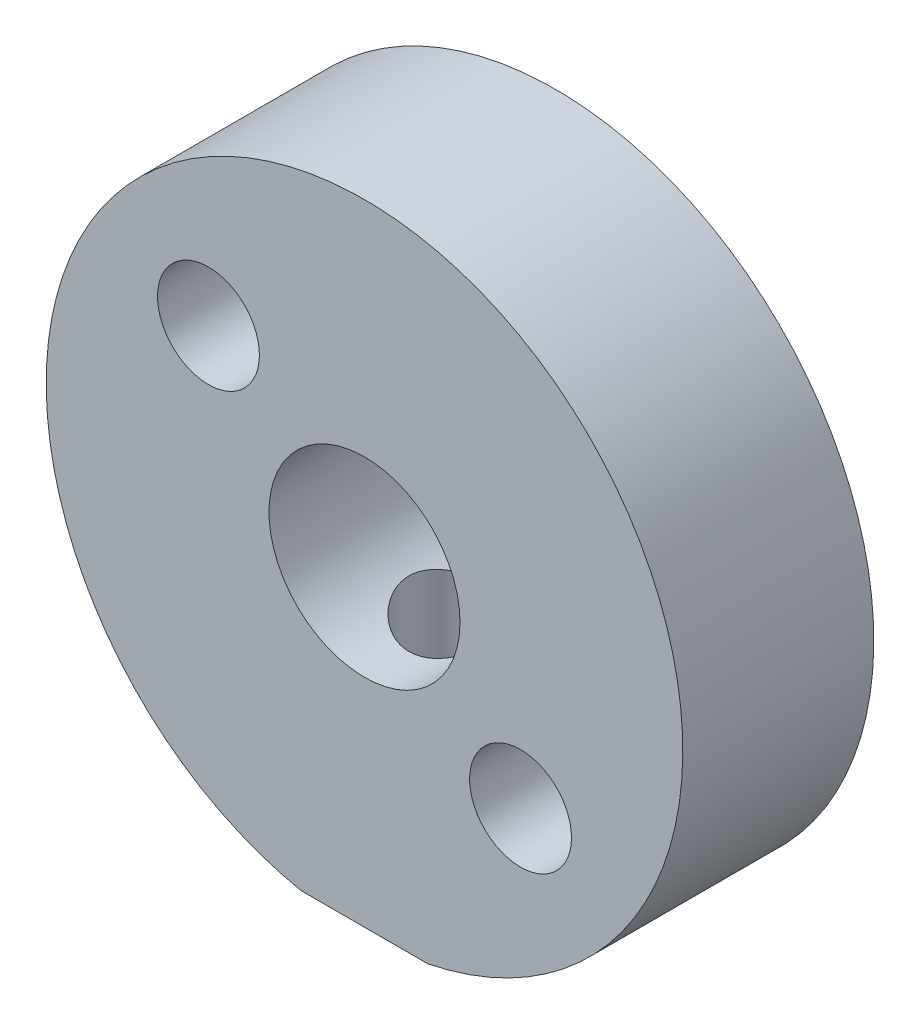
ISO-10303-21;
HEADER;
FILE_DESCRIPTION(('STEP AP214'),'2;1');
FILE_NAME('part.step','',(''),(''),'','','');
FILE_SCHEMA(('AUTOMOTIVE_DESIGN { 1 0 10303 214 1 1 1 1 }'));
ENDSEC;
DATA;
#1=APPLICATION_CONTEXT('core data for automotive mechanical design processes');
#2=APPLICATION_PROTOCOL_DEFINITION('international standard','automotive_design',2000,#1);
#3=PRODUCT_CONTEXT('',#1,'mechanical');
#4=PRODUCT('Part','Part','',(#3));
#5=PRODUCT_RELATED_PRODUCT_CATEGORY('part','',(#4));
#6=PRODUCT_DEFINITION_FORMATION('','',#4);
#7=PRODUCT_DEFINITION_CONTEXT('part definition',#1,'design');
#8=PRODUCT_DEFINITION('design','',#6,#7);
#9=PRODUCT_DEFINITION_SHAPE('','',#8);
#10=(LENGTH_UNIT() NAMED_UNIT(*) SI_UNIT(.MILLI.,.METRE.));
#11=(NAMED_UNIT(*) PLANE_ANGLE_UNIT() SI_UNIT($,.RADIAN.));
#12=(NAMED_UNIT(*) SI_UNIT($,.STERADIAN.) SOLID_ANGLE_UNIT());
#13=UNCERTAINTY_MEASURE_WITH_UNIT(LENGTH_MEASURE(1.E-05),#10,'distance_accuracy_value','');
#14=(GEOMETRIC_REPRESENTATION_CONTEXT(3) GLOBAL_UNCERTAINTY_ASSIGNED_CONTEXT((#13)) GLOBAL_UNIT_ASSIGNED_CONTEXT((#10,
#11,#12)) REPRESENTATION_CONTEXT('',''));
#15=CARTESIAN_POINT('',(0.,0.,0.));
#16=DIRECTION('',(0.,0.,1.));
#17=DIRECTION('',(1.,0.,0.));
#18=AXIS2_PLACEMENT_3D('',#15,#16,#17);
#19=CARTESIAN_POINT('',(0.,0.,1.5));
#20=DIRECTION('',(0.,0.,1.));
#21=DIRECTION('',(1.,0.,0.));
#22=AXIS2_PLACEMENT_3D('',#19,#20,#21);
#23=PLANE('',#22);
#24=DIRECTION('',(-1.,0.,0.));
#25=VECTOR('',#24,1.);
#26=CARTESIAN_POINT('',(0.,-4.9,1.5));
#27=LINE('',#26,#25);
#28=CARTESIAN_POINT('',(0.994987437106618,-4.9,1.5));
#29=VERTEX_POINT('',#28);
#30=CARTESIAN_POINT('',(-0.994987437106618,-4.9,1.5));
#31=VERTEX_POINT('',#30);
#32=EDGE_CURVE('E53',#29,#31,#27,.T.);
#33=ORIENTED_EDGE('',*,*,#32,.F.);
#34=CARTESIAN_POINT('',(0.,0.,1.5));
#35=DIRECTION('',(0.,0.,1.));
#36=DIRECTION('',(1.,0.,0.));
#37=AXIS2_PLACEMENT_3D('',#34,#35,#36);
#38=CIRCLE('',#37,5.);
#39=EDGE_CURVE('E11',#29,#31,#38,.T.);
#40=ORIENTED_EDGE('',*,*,#39,.T.);
#41=EDGE_LOOP('',(#33,#40));
#42=FACE_BOUND('',#41,.T.);
#43=CARTESIAN_POINT('',(-2.45134221797273,2.05692035100051,1.5));
#44=DIRECTION('',(0.,0.,1.));
#45=DIRECTION('',(1.,0.,0.));
#46=AXIS2_PLACEMENT_3D('',#43,#44,#45);
#47=CIRCLE('',#46,0.799999999999498);
#48=CARTESIAN_POINT('',(-1.65134221797323,2.05692035100051,1.5));
#49=VERTEX_POINT('',#48);
#50=EDGE_CURVE('E79',#49,#49,#47,.T.);
#51=ORIENTED_EDGE('',*,*,#50,.F.);
#52=EDGE_LOOP('',(#51));
#53=FACE_BOUND('',#52,.T.);
#54=CARTESIAN_POINT('',(2.45134221797309,-2.05692035100051,1.5));
#55=DIRECTION('',(0.,0.,1.));
#56=DIRECTION('',(1.,0.,0.));
#57=AXIS2_PLACEMENT_3D('',#54,#55,#56);
#58=CIRCLE('',#57,0.800000000000502);
#59=CARTESIAN_POINT('',(3.25134221797359,-2.05692035100051,1.5));
#60=VERTEX_POINT('',#59);
#61=EDGE_CURVE('E87',#60,#60,#58,.T.);
#62=ORIENTED_EDGE('',*,*,#61,.F.);
#63=EDGE_LOOP('',(#62));
#64=FACE_BOUND('',#63,.T.);
#65=CARTESIAN_POINT('',(0.,0.,1.5));
#66=DIRECTION('',(0.,0.,1.));
#67=DIRECTION('',(1.,0.,0.));
#68=AXIS2_PLACEMENT_3D('',#65,#66,#67);
#69=CIRCLE('',#68,1.5);
#70=CARTESIAN_POINT('',(1.5,0.,1.5));
#71=VERTEX_POINT('',#70);
#72=EDGE_CURVE('E92',#71,#71,#69,.T.);
#73=ORIENTED_EDGE('',*,*,#72,.F.);
#74=EDGE_LOOP('',(#73));
#75=FACE_BOUND('',#74,.T.);
#76=ADVANCED_FACE('F36',(#42,#53,#64,#75),#23,.T.);
#77=CARTESIAN_POINT('',(0.,0.,-1.5));
#78=DIRECTION('',(0.,0.,1.));
#79=DIRECTION('',(1.,0.,0.));
#80=AXIS2_PLACEMENT_3D('',#77,#78,#79);
#81=PLANE('',#80);
#82=CARTESIAN_POINT('',(-2.45134221797273,2.05692035100051,-1.5));
#83=DIRECTION('',(0.,0.,1.));
#84=DIRECTION('',(1.,0.,0.));
#85=AXIS2_PLACEMENT_3D('',#82,#83,#84);
#86=CIRCLE('',#85,0.799999999999498);
#87=CARTESIAN_POINT('',(-1.65134221797323,2.05692035100051,-1.5));
#88=VERTEX_POINT('',#87);
#89=EDGE_CURVE('E82',#88,#88,#86,.T.);
#90=ORIENTED_EDGE('',*,*,#89,.T.);
#91=EDGE_LOOP('',(#90));
#92=FACE_BOUND('',#91,.T.);
#93=CARTESIAN_POINT('',(2.45134221797309,-2.05692035100051,-1.5));
#94=DIRECTION('',(0.,0.,1.));
#95=DIRECTION('',(1.,0.,0.));
#96=AXIS2_PLACEMENT_3D('',#93,#94,#95);
#97=CIRCLE('',#96,0.800000000000502);
#98=CARTESIAN_POINT('',(3.25134221797359,-2.05692035100051,-1.5));
#99=VERTEX_POINT('',#98);
#100=EDGE_CURVE('E83',#99,#99,#97,.T.);
#101=ORIENTED_EDGE('',*,*,#100,.T.);
#102=EDGE_LOOP('',(#101));
#103=FACE_BOUND('',#102,.T.);
#104=CARTESIAN_POINT('',(0.,0.,-1.5));
#105=DIRECTION('',(0.,0.,1.));
#106=DIRECTION('',(1.,0.,0.));
#107=AXIS2_PLACEMENT_3D('',#104,#105,#106);
#108=CIRCLE('',#107,5.);
#109=CARTESIAN_POINT('',(0.994987437106618,-4.9,-1.5));
#110=VERTEX_POINT('',#109);
#111=CARTESIAN_POINT('',(-0.994987437106618,-4.9,-1.5));
#112=VERTEX_POINT('',#111);
#113=EDGE_CURVE('E45',#110,#112,#108,.T.);
#114=ORIENTED_EDGE('',*,*,#113,.F.);
#115=DIRECTION('',(-1.,0.,0.));
#116=VECTOR('',#115,1.);
#117=CARTESIAN_POINT('',(0.,-4.9,-1.5));
#118=LINE('',#117,#116);
#119=EDGE_CURVE('E65',#110,#112,#118,.T.);
#120=ORIENTED_EDGE('',*,*,#119,.T.);
#121=EDGE_LOOP('',(#114,#120));
#122=FACE_BOUND('',#121,.T.);
#123=CARTESIAN_POINT('',(0.,0.,-1.5));
#124=DIRECTION('',(0.,0.,1.));
#125=DIRECTION('',(1.,0.,0.));
#126=AXIS2_PLACEMENT_3D('',#123,#124,#125);
#127=CIRCLE('',#126,1.5);
#128=CARTESIAN_POINT('',(1.5,0.,-1.5));
#129=VERTEX_POINT('',#128);
#130=EDGE_CURVE('E86',#129,#129,#127,.T.);
#131=ORIENTED_EDGE('',*,*,#130,.T.);
#132=EDGE_LOOP('',(#131));
#133=FACE_BOUND('',#132,.T.);
#134=ADVANCED_FACE('F125',(#92,#103,#122,#133),#81,.F.);
#135=CARTESIAN_POINT('',(0.,0.,1.5));
#136=DIRECTION('',(0.,0.,-1.));
#137=DIRECTION('',(-1.,0.,0.));
#138=AXIS2_PLACEMENT_3D('',#135,#136,#137);
#139=CYLINDRICAL_SURFACE('',#138,5.);
#140=ORIENTED_EDGE('',*,*,#39,.F.);
#141=DIRECTION('',(0.,0.,-1.));
#142=VECTOR('',#141,1.);
#143=CARTESIAN_POINT('',(0.994987437106618,-4.9,1.5));
#144=LINE('',#143,#142);
#145=EDGE_CURVE('E63',#29,#110,#144,.T.);
#146=ORIENTED_EDGE('',*,*,#145,.T.);
#147=ORIENTED_EDGE('',*,*,#113,.T.);
#148=DIRECTION('',(0.,0.,-1.));
#149=VECTOR('',#148,1.);
#150=CARTESIAN_POINT('',(-0.994987437106618,-4.9,1.5));
#151=LINE('',#150,#149);
#152=EDGE_CURVE('E57',#112,#31,#151,.F.);
#153=ORIENTED_EDGE('',*,*,#152,.T.);
#154=EDGE_LOOP('',(#140,#146,#147,#153));
#155=FACE_BOUND('',#154,.T.);
#156=ADVANCED_FACE('F38',(#155),#139,.T.);
#157=CARTESIAN_POINT('',(0.,0.,1.5));
#158=DIRECTION('',(0.,0.,-1.));
#159=DIRECTION('',(-1.,0.,0.));
#160=AXIS2_PLACEMENT_3D('',#157,#158,#159);
#161=CYLINDRICAL_SURFACE('',#160,1.5);
#162=CARTESIAN_POINT('',(0.,-1.5,0.8));
#163=CARTESIAN_POINT('',(0.041714004293709,-1.49999758414449,0.79999729171022));
#164=CARTESIAN_POINT('',(0.0834672912539168,-1.49824189360224,0.796718403587561));
#165=CARTESIAN_POINT('',(0.165718197334509,-1.49139129667971,0.783758299133951));
#166=CARTESIAN_POINT('',(0.206213769841148,-1.48629121869364,0.774067166996487));
#167=CARTESIAN_POINT('',(0.284638594945811,-1.47328036800654,0.748780160141689));
#168=CARTESIAN_POINT('',(0.322577512237572,-1.46538097991501,0.733208185810114));
#169=CARTESIAN_POINT('',(0.395235474229212,-1.4474774987237,0.696737448288011));
#170=CARTESIAN_POINT('',(0.429954504316264,-1.43747339607276,0.675838660924399));
#171=CARTESIAN_POINT('',(0.497767319459639,-1.41547900666031,0.627748438268247));
#172=CARTESIAN_POINT('',(0.530602027463185,-1.4034011481073,0.60023239648025));
#173=CARTESIAN_POINT('',(0.591434030661653,-1.37887042167267,0.540396854313251));
#174=CARTESIAN_POINT('',(0.619427089896366,-1.36641723648963,0.508073193266347));
#175=CARTESIAN_POINT('',(0.672354419511099,-1.34122140682262,0.436021941522241));
#176=CARTESIAN_POINT('',(0.696776837026744,-1.32855595701366,0.395887951336953));
#177=CARTESIAN_POINT('',(0.738426416316996,-1.30586838669548,0.311354318648837));
#178=CARTESIAN_POINT('',(0.755659138193531,-1.29584422578236,0.266958005193252));
#179=CARTESIAN_POINT('',(0.781243551670882,-1.28057394848523,0.177945730638708));
#180=CARTESIAN_POINT('',(0.790083117424791,-1.27506829565278,0.13351702790959));
#181=CARTESIAN_POINT('',(0.800094972405448,-1.26881331156942,0.0434961280342448));
#182=CARTESIAN_POINT('',(0.801276946959554,-1.26805797215382,-0.00209452613423204));
#183=CARTESIAN_POINT('',(0.796296021649253,-1.27118648805135,-0.0862218656466407));
#184=CARTESIAN_POINT('',(0.791143222976706,-1.2744325135639,-0.124848446622228));
#185=CARTESIAN_POINT('',(0.775413455073683,-1.28406317281932,-0.200574623942005));
#186=CARTESIAN_POINT('',(0.764834303757537,-1.29044906914779,-0.237673599505729));
#187=CARTESIAN_POINT('',(0.738390252390663,-1.30576277857079,-0.310338026573563));
#188=CARTESIAN_POINT('',(0.722411944930874,-1.31474447400447,-0.345850303085015));
#189=CARTESIAN_POINT('',(0.685716522966988,-1.3342504708289,-0.413869526357397));
#190=CARTESIAN_POINT('',(0.664997308543691,-1.34477545505385,-0.446375132369022));
#191=CARTESIAN_POINT('',(0.615868522436844,-1.36804524940245,-0.512485861213274));
#192=CARTESIAN_POINT('',(0.586776291159892,-1.38088899493241,-0.545550735246708));
#193=CARTESIAN_POINT('',(0.523451373374352,-1.40611558623123,-0.606575357689949));
#194=CARTESIAN_POINT('',(0.489215573049462,-1.41849814710228,-0.634531990793125));
#195=CARTESIAN_POINT('',(0.41402207703118,-1.44230010999534,-0.686137714914207));
#196=CARTESIAN_POINT('',(0.372785484410791,-1.45361823088172,-0.70943110819391));
#197=CARTESIAN_POINT('',(0.286226859736144,-1.47310395304255,-0.748547883176902));
#198=CARTESIAN_POINT('',(0.240908517249558,-1.48127436501701,-0.764377932003115));
#199=CARTESIAN_POINT('',(0.151832213955905,-1.4929099561423,-0.78667761240728));
#200=CARTESIAN_POINT('',(0.108300131382031,-1.49673204992477,-0.793860701309987));
#201=CARTESIAN_POINT('',(0.0204895975412033,-1.50050221027202,-0.800947503200433));
#202=CARTESIAN_POINT('',(-0.0237884072844008,-1.50045251716091,-0.80085542580229));
#203=CARTESIAN_POINT('',(-0.107545959760608,-1.49667382258832,-0.793750071169325));
#204=CARTESIAN_POINT('',(-0.147096449267732,-1.49327897244287,-0.787365359251738));
#205=CARTESIAN_POINT('',(-0.224469554831582,-1.48362188327846,-0.768892557902082));
#206=CARTESIAN_POINT('',(-0.262291990687247,-1.47735934596487,-0.756803875143303));
#207=CARTESIAN_POINT('',(-0.336250167522202,-1.46232570811689,-0.727025057531773));
#208=CARTESIAN_POINT('',(-0.372320333376869,-1.4534959496239,-0.709202765081717));
#209=CARTESIAN_POINT('',(-0.441062157410962,-1.43413438081761,-0.668624845698398));
#210=CARTESIAN_POINT('',(-0.473732482002725,-1.42360190671964,-0.645867293623103));
#211=CARTESIAN_POINT('',(-0.538489644606411,-1.40047645695353,-0.59325519889227));
#212=CARTESIAN_POINT('',(-0.570134865108252,-1.38778372966929,-0.56290033267114));
#213=CARTESIAN_POINT('',(-0.628109862741503,-1.36252708549313,-0.497387164084843));
#214=CARTESIAN_POINT('',(-0.654434715474712,-1.34996329805962,-0.462224461707956));
#215=CARTESIAN_POINT('',(-0.70274076630891,-1.32549514327965,-0.385173513824971));
#216=CARTESIAN_POINT('',(-0.724310244689175,-1.31369210729127,-0.342991861220585));
#217=CARTESIAN_POINT('',(-0.759824848176573,-1.29347935062968,-0.25478990991383));
#218=CARTESIAN_POINT('',(-0.773780830369481,-1.28506480237657,-0.208775185878254));
#219=CARTESIAN_POINT('',(-0.792295451806952,-1.27372513461019,-0.118986152902457));
#220=CARTESIAN_POINT('',(-0.797640611545244,-1.27034308682665,-0.0754338162845399));
#221=CARTESIAN_POINT('',(-0.801103834511684,-1.26816359887642,0.0120603141803605));
#222=CARTESIAN_POINT('',(-0.799226824740039,-1.26936303319563,0.0560018221225666));
#223=CARTESIAN_POINT('',(-0.789056350744178,-1.27570247677833,0.137346354858054));
#224=CARTESIAN_POINT('',(-0.781570591370404,-1.28034575552508,0.174894890727509));
#225=CARTESIAN_POINT('',(-0.761493436479322,-1.29238691721072,0.248133957541068));
#226=CARTESIAN_POINT('',(-0.748900147495982,-1.29978582163339,0.283823793884208));
#227=CARTESIAN_POINT('',(-0.718080352112418,-1.3170766557443,0.354904779546557));
#228=CARTESIAN_POINT('',(-0.699543207429632,-1.32709848411839,0.390128567415769));
#229=CARTESIAN_POINT('',(-0.657671226676286,-1.34833960706443,0.457201935759752));
#230=CARTESIAN_POINT('',(-0.634333807313365,-1.35955954483521,0.489049685359359));
#231=CARTESIAN_POINT('',(-0.579583602633468,-1.38387269806828,0.553273093880293));
#232=CARTESIAN_POINT('',(-0.547491018352179,-1.39700212075101,0.585058740448831));
#233=CARTESIAN_POINT('',(-0.47815016455982,-1.42222830059072,0.64297227038809));
#234=CARTESIAN_POINT('',(-0.440898582826824,-1.43432438618419,0.669096491103799));
#235=CARTESIAN_POINT('',(-0.361022002622199,-1.45651015109521,0.715433959936658));
#236=CARTESIAN_POINT('',(-0.318288665753908,-1.4665441059256,0.735488626424893));
#237=CARTESIAN_POINT('',(-0.229399331630396,-1.48303856571174,0.767853622733874));
#238=CARTESIAN_POINT('',(-0.183252846928633,-1.48950860714735,0.780184632122339));
#239=CARTESIAN_POINT('',(-0.113807677907482,-1.49584776109147,0.792192671272072));
#240=CARTESIAN_POINT('',(-0.0911777471195387,-1.49739944315896,0.795114884201634));
#241=CARTESIAN_POINT('',(-0.0457024774465214,-1.49947623062919,0.799019302158529));
#242=CARTESIAN_POINT('',(-0.0228571359907307,-1.50000132376498,0.800001484003966));
#243=CARTESIAN_POINT('',(0.,-1.5,0.8));
#244=B_SPLINE_CURVE_WITH_KNOTS('',3,(#162,#163,#164,#165,#166,#167,#168,#169,#170,#171,#172,
#173,#174,#175,#176,#177,#178,#179,#180,#181,#182,#183,#184,#185,#186,#187,#188,#189,#190,#191,
#192,#193,#194,#195,#196,#197,#198,#199,#200,#201,#202,#203,#204,#205,#206,#207,#208,#209,#210,
#211,#212,#213,#214,#215,#216,#217,#218,#219,#220,#221,#222,#223,#224,#225,#226,#227,#228,#229,
#230,#231,#232,#233,#234,#235,#236,#237,#238,#239,#240,#241,#242,#243),.UNSPECIFIED.,.T.,.F.,(4,
2,2,2,2,2,2,2,2,2,2,2,2,2,2,2,2,2,2,2,2,2,2,2,2,2,2,2,2,2,2,2,2,2,2,2,2,2,2,2,4),(0.,
0.125049785968992,0.250293400579707,0.375033395431379,0.49977395636337,0.632758937517726,
0.765859685119312,0.911100210896854,1.0562282067719,1.19228300426694,1.32816568589671,
1.44492819552126,1.5617376954166,1.68117137196064,1.80065805275817,1.93770170276478,
2.07482865313357,2.22012229846781,2.3652859036198,2.49740165319181,2.62944095746675,
2.74950324975936,2.86957803367867,2.99264692026345,3.11576390008819,3.2521377258514,
3.38863720347795,3.53432584534744,3.67980618389779,3.81103787448892,3.94218005404205,
4.05738088818269,4.17262446873054,4.29529226385602,4.41802624681408,4.55851375899382,
4.69909188991155,4.84307664846754,4.98667423094967,5.05519428454422,5.12371515689634),.UNSPECIFIED.);
#245=CARTESIAN_POINT('',(0.,-1.5,0.8));
#246=VERTEX_POINT('',#245);
#247=EDGE_CURVE('E70',#246,#246,#244,.T.);
#248=ORIENTED_EDGE('',*,*,#247,.F.);
#249=EDGE_LOOP('',(#248));
#250=FACE_BOUND('',#249,.T.);
#251=ORIENTED_EDGE('',*,*,#72,.T.);
#252=EDGE_LOOP('',(#251));
#253=FACE_BOUND('',#252,.T.);
#254=ORIENTED_EDGE('',*,*,#130,.F.);
#255=EDGE_LOOP('',(#254));
#256=FACE_BOUND('',#255,.T.);
#257=ADVANCED_FACE('F102',(#250,#253,#256),#161,.F.);
#258=CARTESIAN_POINT('',(2.45134221797309,-2.05692035100051,-1.5));
#259=DIRECTION('',(0.,0.,1.));
#260=DIRECTION('',(1.,0.,0.));
#261=AXIS2_PLACEMENT_3D('',#258,#259,#260);
#262=CYLINDRICAL_SURFACE('',#261,0.800000000000502);
#263=ORIENTED_EDGE('',*,*,#100,.F.);
#264=EDGE_LOOP('',(#263));
#265=FACE_BOUND('',#264,.T.);
#266=ORIENTED_EDGE('',*,*,#61,.T.);
#267=EDGE_LOOP('',(#266));
#268=FACE_BOUND('',#267,.T.);
#269=ADVANCED_FACE('F114',(#265,#268),#262,.F.);
#270=CARTESIAN_POINT('',(-2.45134221797273,2.05692035100051,-1.5));
#271=DIRECTION('',(0.,0.,1.));
#272=DIRECTION('',(1.,0.,0.));
#273=AXIS2_PLACEMENT_3D('',#270,#271,#272);
#274=CYLINDRICAL_SURFACE('',#273,0.799999999999498);
#275=ORIENTED_EDGE('',*,*,#89,.F.);
#276=EDGE_LOOP('',(#275));
#277=FACE_BOUND('',#276,.T.);
#278=ORIENTED_EDGE('',*,*,#50,.T.);
#279=EDGE_LOOP('',(#278));
#280=FACE_BOUND('',#279,.T.);
#281=ADVANCED_FACE('F111',(#277,#280),#274,.F.);
#282=CARTESIAN_POINT('',(0.,-5.,0.));
#283=DIRECTION('',(0.,1.,0.));
#284=DIRECTION('',(0.,0.,1.));
#285=AXIS2_PLACEMENT_3D('',#282,#283,#284);
#286=CYLINDRICAL_SURFACE('',#285,0.8);
#287=CARTESIAN_POINT('',(0.,-4.9,0.));
#288=DIRECTION('',(0.,1.,0.));
#289=DIRECTION('',(0.,0.,1.));
#290=AXIS2_PLACEMENT_3D('',#287,#288,#289);
#291=CIRCLE('',#290,0.8);
#292=CARTESIAN_POINT('',(0.,-4.9,0.8));
#293=VERTEX_POINT('',#292);
#294=EDGE_CURVE('E40',#293,#293,#291,.F.);
#295=ORIENTED_EDGE('',*,*,#294,.T.);
#296=EDGE_LOOP('',(#295));
#297=FACE_BOUND('',#296,.T.);
#298=ORIENTED_EDGE('',*,*,#247,.T.);
#299=EDGE_LOOP('',(#298));
#300=FACE_BOUND('',#299,.T.);
#301=ADVANCED_FACE('F106',(#297,#300),#286,.F.);
#302=CARTESIAN_POINT('',(0.,-4.9,-1.5));
#303=DIRECTION('',(0.,1.,0.));
#304=DIRECTION('',(0.,0.,1.));
#305=AXIS2_PLACEMENT_3D('',#302,#303,#304);
#306=PLANE('',#305);
#307=ORIENTED_EDGE('',*,*,#294,.F.);
#308=EDGE_LOOP('',(#307));
#309=FACE_BOUND('',#308,.T.);
#310=ORIENTED_EDGE('',*,*,#32,.T.);
#311=ORIENTED_EDGE('',*,*,#152,.F.);
#312=ORIENTED_EDGE('',*,*,#119,.F.);
#313=ORIENTED_EDGE('',*,*,#145,.F.);
#314=EDGE_LOOP('',(#310,#311,#312,#313));
#315=FACE_BOUND('',#314,.T.);
#316=ADVANCED_FACE('F64',(#309,#315),#306,.F.);
#317=CLOSED_SHELL('',(#76,#134,#156,#257,#269,#281,#301,#316));
#318=MANIFOLD_SOLID_BREP('B2',#317);
#319=ADVANCED_BREP_SHAPE_REPRESENTATION('',(#18,#318),#14);
#320=SHAPE_DEFINITION_REPRESENTATION(#9,#319);
ENDSEC;
END-ISO-10303-21;
